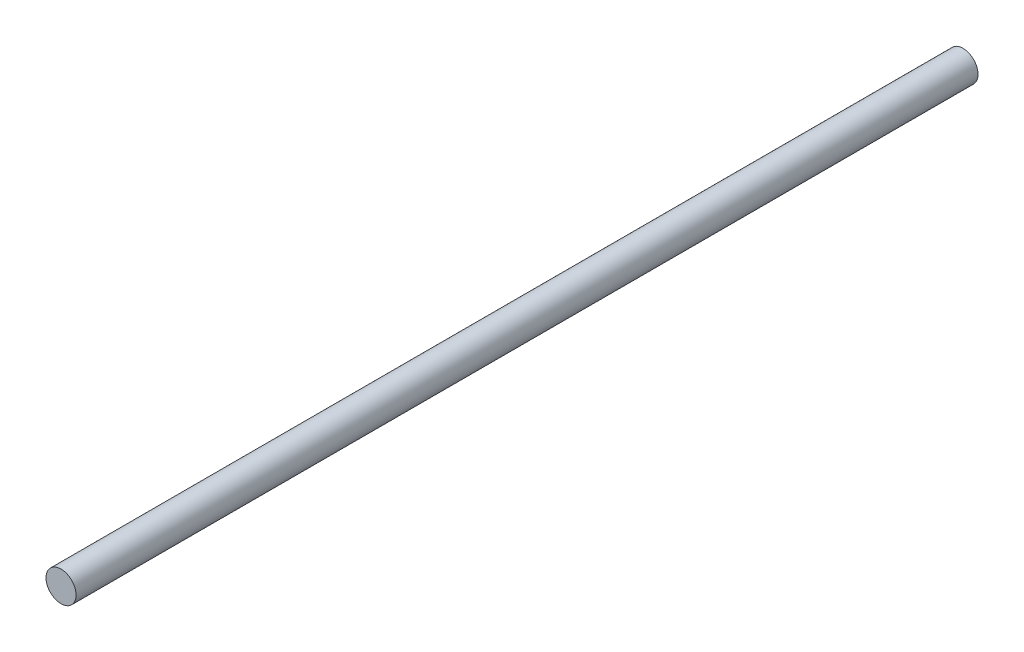
ISO-10303-21;
HEADER;
FILE_DESCRIPTION(('STEP AP214'),'2;1');
FILE_NAME('part.step','',(''),(''),'','','');
FILE_SCHEMA(('AUTOMOTIVE_DESIGN { 1 0 10303 214 1 1 1 1 }'));
ENDSEC;
DATA;
#1=APPLICATION_CONTEXT('core data for automotive mechanical design processes');
#2=APPLICATION_PROTOCOL_DEFINITION('international standard','automotive_design',2000,#1);
#3=PRODUCT_CONTEXT('',#1,'mechanical');
#4=PRODUCT('Part','Part','',(#3));
#5=PRODUCT_RELATED_PRODUCT_CATEGORY('part','',(#4));
#6=PRODUCT_DEFINITION_FORMATION('','',#4);
#7=PRODUCT_DEFINITION_CONTEXT('part definition',#1,'design');
#8=PRODUCT_DEFINITION('design','',#6,#7);
#9=PRODUCT_DEFINITION_SHAPE('','',#8);
#10=(LENGTH_UNIT() NAMED_UNIT(*) SI_UNIT(.MILLI.,.METRE.));
#11=(NAMED_UNIT(*) PLANE_ANGLE_UNIT() SI_UNIT($,.RADIAN.));
#12=(NAMED_UNIT(*) SI_UNIT($,.STERADIAN.) SOLID_ANGLE_UNIT());
#13=UNCERTAINTY_MEASURE_WITH_UNIT(LENGTH_MEASURE(1.E-05),#10,'distance_accuracy_value','');
#14=(GEOMETRIC_REPRESENTATION_CONTEXT(3) GLOBAL_UNCERTAINTY_ASSIGNED_CONTEXT((#13)) GLOBAL_UNIT_ASSIGNED_CONTEXT((#10,
#11,#12)) REPRESENTATION_CONTEXT('',''));
#15=CARTESIAN_POINT('',(0.,0.,0.));
#16=DIRECTION('',(0.,0.,1.));
#17=DIRECTION('',(1.,0.,0.));
#18=AXIS2_PLACEMENT_3D('',#15,#16,#17);
#19=CARTESIAN_POINT('',(0.,0.,90.));
#20=DIRECTION('',(0.,0.,-1.));
#21=DIRECTION('',(-1.,0.,0.));
#22=AXIS2_PLACEMENT_3D('',#19,#20,#21);
#23=CYLINDRICAL_SURFACE('',#22,1.5);
#24=CARTESIAN_POINT('',(0.,0.,90.));
#25=DIRECTION('',(0.,0.,1.));
#26=DIRECTION('',(1.,0.,0.));
#27=AXIS2_PLACEMENT_3D('',#24,#25,#26);
#28=CIRCLE('',#27,1.5);
#29=CARTESIAN_POINT('',(-1.5,0.,90.));
#30=VERTEX_POINT('',#29);
#31=EDGE_CURVE('E10',#30,#30,#28,.T.);
#32=CARTESIAN_POINT('',(0.,0.,0.));
#33=DIRECTION('',(0.,0.,1.));
#34=DIRECTION('',(1.,0.,0.));
#35=AXIS2_PLACEMENT_3D('',#32,#33,#34);
#36=CIRCLE('',#35,1.5);
#37=CARTESIAN_POINT('',(-1.5,0.,0.));
#38=VERTEX_POINT('',#37);
#39=EDGE_CURVE('E43',#38,#38,#36,.T.);
#40=CARTESIAN_POINT('',(-1.5,0.,90.));
#41=CARTESIAN_POINT('',(-1.5,0.,89.0625));
#42=CARTESIAN_POINT('',(-1.5,0.,88.125));
#43=CARTESIAN_POINT('',(-1.5,0.,86.25));
#44=CARTESIAN_POINT('',(-1.5,0.,85.3125));
#45=CARTESIAN_POINT('',(-1.5,0.,83.4375));
#46=CARTESIAN_POINT('',(-1.5,0.,82.5));
#47=CARTESIAN_POINT('',(-1.5,0.,80.625));
#48=CARTESIAN_POINT('',(-1.5,0.,79.6875));
#49=CARTESIAN_POINT('',(-1.5,0.,77.8125));
#50=CARTESIAN_POINT('',(-1.5,0.,76.875));
#51=CARTESIAN_POINT('',(-1.5,0.,75.));
#52=CARTESIAN_POINT('',(-1.5,0.,74.0625));
#53=CARTESIAN_POINT('',(-1.5,0.,72.1875));
#54=CARTESIAN_POINT('',(-1.5,0.,71.25));
#55=CARTESIAN_POINT('',(-1.5,0.,69.375));
#56=CARTESIAN_POINT('',(-1.5,0.,68.4375));
#57=CARTESIAN_POINT('',(-1.5,0.,66.5625));
#58=CARTESIAN_POINT('',(-1.5,0.,65.625));
#59=CARTESIAN_POINT('',(-1.5,0.,63.75));
#60=CARTESIAN_POINT('',(-1.5,0.,62.8125));
#61=CARTESIAN_POINT('',(-1.5,0.,60.9375));
#62=CARTESIAN_POINT('',(-1.5,0.,60.));
#63=CARTESIAN_POINT('',(-1.5,0.,58.125));
#64=CARTESIAN_POINT('',(-1.5,0.,57.1875));
#65=CARTESIAN_POINT('',(-1.5,0.,55.3125));
#66=CARTESIAN_POINT('',(-1.5,0.,54.375));
#67=CARTESIAN_POINT('',(-1.5,0.,52.5));
#68=CARTESIAN_POINT('',(-1.5,0.,51.5625));
#69=CARTESIAN_POINT('',(-1.5,0.,49.6875));
#70=CARTESIAN_POINT('',(-1.5,0.,48.75));
#71=CARTESIAN_POINT('',(-1.5,0.,46.875));
#72=CARTESIAN_POINT('',(-1.5,0.,45.9375));
#73=CARTESIAN_POINT('',(-1.5,0.,44.0625));
#74=CARTESIAN_POINT('',(-1.5,0.,43.125));
#75=CARTESIAN_POINT('',(-1.5,0.,41.25));
#76=CARTESIAN_POINT('',(-1.5,0.,40.3125));
#77=CARTESIAN_POINT('',(-1.5,0.,38.4375));
#78=CARTESIAN_POINT('',(-1.5,0.,37.5));
#79=CARTESIAN_POINT('',(-1.5,0.,35.625));
#80=CARTESIAN_POINT('',(-1.5,0.,34.6875));
#81=CARTESIAN_POINT('',(-1.5,0.,32.8125));
#82=CARTESIAN_POINT('',(-1.5,0.,31.875));
#83=CARTESIAN_POINT('',(-1.5,0.,30.));
#84=CARTESIAN_POINT('',(-1.5,0.,29.0625));
#85=CARTESIAN_POINT('',(-1.5,0.,27.1875));
#86=CARTESIAN_POINT('',(-1.5,0.,26.25));
#87=CARTESIAN_POINT('',(-1.5,0.,24.375));
#88=CARTESIAN_POINT('',(-1.5,0.,23.4375));
#89=CARTESIAN_POINT('',(-1.5,0.,21.5625));
#90=CARTESIAN_POINT('',(-1.5,0.,20.625));
#91=CARTESIAN_POINT('',(-1.5,0.,18.75));
#92=CARTESIAN_POINT('',(-1.5,0.,17.8125));
#93=CARTESIAN_POINT('',(-1.5,0.,15.9375));
#94=CARTESIAN_POINT('',(-1.5,0.,15.));
#95=CARTESIAN_POINT('',(-1.5,0.,13.125));
#96=CARTESIAN_POINT('',(-1.5,0.,12.1875));
#97=CARTESIAN_POINT('',(-1.5,0.,10.3125));
#98=CARTESIAN_POINT('',(-1.5,0.,9.37499999999999));
#99=CARTESIAN_POINT('',(-1.5,0.,7.49999999999999));
#100=CARTESIAN_POINT('',(-1.5,0.,6.56249999999999));
#101=CARTESIAN_POINT('',(-1.5,0.,4.68749999999999));
#102=CARTESIAN_POINT('',(-1.5,0.,3.74999999999998));
#103=CARTESIAN_POINT('',(-1.5,0.,1.87499999999998));
#104=CARTESIAN_POINT('',(-1.5,0.,0.937499999999986));
#105=CARTESIAN_POINT('',(-1.5,0.,0.));
#106=B_SPLINE_CURVE_WITH_KNOTS('',3,(#40,#41,#42,#43,#44,#45,#46,#47,#48,#49,#50,#51,#52,#53,
#54,#55,#56,#57,#58,#59,#60,#61,#62,#63,#64,#65,#66,#67,#68,#69,#70,#71,#72,#73,#74,#75,#76,#77,
#78,#79,#80,#81,#82,#83,#84,#85,#86,#87,#88,#89,#90,#91,#92,#93,#94,#95,#96,#97,#98,#99,#100,
#101,#102,#103,#104,#105),.UNSPECIFIED.,.F.,.F.,(4,2,2,2,2,2,2,2,2,2,2,2,2,2,2,2,2,2,2,2,2,2,2,
2,2,2,2,2,2,2,2,2,4),(0.,2.81250000000001,5.62500000000001,8.43750000000001,11.25,14.0625,
16.875,19.6875,22.5,25.3125,28.125,30.9375,33.75,36.5625,39.375,42.1875,45.,47.8125,50.625,
53.4375,56.25,59.0625,61.875,64.6875,67.5,70.3125,73.125,75.9375,78.75,81.5625,84.375,87.1875,
90.),.UNSPECIFIED.);
#107=EDGE_CURVE('BSEAM40',#30,#38,#106,.T.);
#108=ORIENTED_EDGE('',*,*,#31,.F.);
#109=ORIENTED_EDGE('',*,*,#39,.T.);
#110=ORIENTED_EDGE('',*,*,#107,.T.);
#111=ORIENTED_EDGE('',*,*,#107,.F.);
#112=EDGE_LOOP('',(#108,#110,#109,#111));
#113=FACE_BOUND('',#112,.T.);
#114=ADVANCED_FACE('F40',(#113),#23,.T.);
#115=CARTESIAN_POINT('',(0.,0.,90.));
#116=DIRECTION('',(0.,0.,1.));
#117=DIRECTION('',(1.,0.,0.));
#118=AXIS2_PLACEMENT_3D('',#115,#116,#117);
#119=PLANE('',#118);
#120=ORIENTED_EDGE('',*,*,#31,.T.);
#121=EDGE_LOOP('',(#120));
#122=FACE_BOUND('',#121,.T.);
#123=ADVANCED_FACE('F57',(#122),#119,.T.);
#124=CARTESIAN_POINT('',(0.,0.,0.));
#125=DIRECTION('',(0.,0.,1.));
#126=DIRECTION('',(1.,0.,0.));
#127=AXIS2_PLACEMENT_3D('',#124,#125,#126);
#128=PLANE('',#127);
#129=ORIENTED_EDGE('',*,*,#39,.F.);
#130=EDGE_LOOP('',(#129));
#131=FACE_BOUND('',#130,.T.);
#132=ADVANCED_FACE('F55',(#131),#128,.F.);
#133=CLOSED_SHELL('',(#114,#123,#132));
#134=MANIFOLD_SOLID_BREP('B2',#133);
#135=ADVANCED_BREP_SHAPE_REPRESENTATION('',(#18,#134),#14);
#136=SHAPE_DEFINITION_REPRESENTATION(#9,#135);
ENDSEC;
END-ISO-10303-21;
